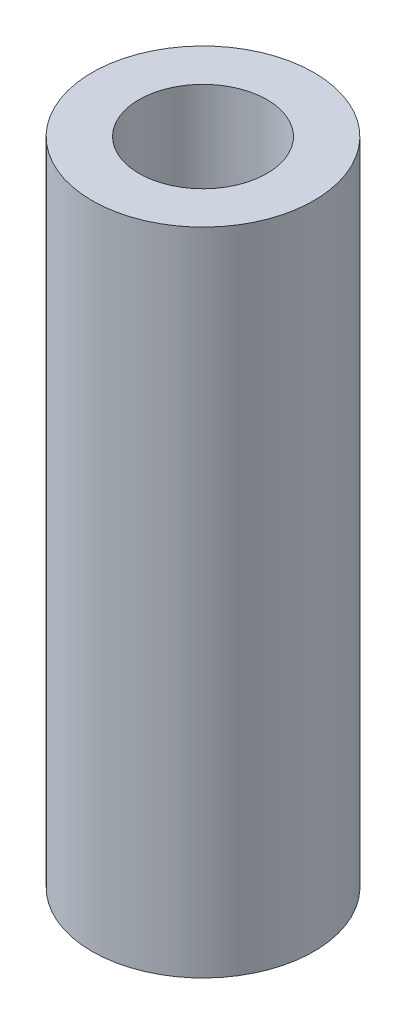
ISO-10303-21;
HEADER;
FILE_DESCRIPTION(('STEP AP214'),'2;1');
FILE_NAME('part.step','',(''),(''),'','','');
FILE_SCHEMA(('AUTOMOTIVE_DESIGN { 1 0 10303 214 1 1 1 1 }'));
ENDSEC;
DATA;
#1=APPLICATION_CONTEXT('core data for automotive mechanical design processes');
#2=APPLICATION_PROTOCOL_DEFINITION('international standard','automotive_design',2000,#1);
#3=PRODUCT_CONTEXT('',#1,'mechanical');
#4=PRODUCT('Part','Part','',(#3));
#5=PRODUCT_RELATED_PRODUCT_CATEGORY('part','',(#4));
#6=PRODUCT_DEFINITION_FORMATION('','',#4);
#7=PRODUCT_DEFINITION_CONTEXT('part definition',#1,'design');
#8=PRODUCT_DEFINITION('design','',#6,#7);
#9=PRODUCT_DEFINITION_SHAPE('','',#8);
#10=(LENGTH_UNIT() NAMED_UNIT(*) SI_UNIT(.MILLI.,.METRE.));
#11=(NAMED_UNIT(*) PLANE_ANGLE_UNIT() SI_UNIT($,.RADIAN.));
#12=(NAMED_UNIT(*) SI_UNIT($,.STERADIAN.) SOLID_ANGLE_UNIT());
#13=UNCERTAINTY_MEASURE_WITH_UNIT(LENGTH_MEASURE(1.E-05),#10,'distance_accuracy_value','');
#14=(GEOMETRIC_REPRESENTATION_CONTEXT(3) GLOBAL_UNCERTAINTY_ASSIGNED_CONTEXT((#13)) GLOBAL_UNIT_ASSIGNED_CONTEXT((#10,
#11,#12)) REPRESENTATION_CONTEXT('',''));
#15=CARTESIAN_POINT('',(0.,0.,0.));
#16=DIRECTION('',(0.,0.,1.));
#17=DIRECTION('',(1.,0.,0.));
#18=AXIS2_PLACEMENT_3D('',#15,#16,#17);
#19=CARTESIAN_POINT('',(0.,19.05,0.));
#20=DIRECTION('',(0.,1.,0.));
#21=DIRECTION('',(0.,0.,1.));
#22=AXIS2_PLACEMENT_3D('',#19,#20,#21);
#23=PLANE('',#22);
#24=CARTESIAN_POINT('',(0.,19.05,0.));
#25=DIRECTION('',(0.,1.,0.));
#26=DIRECTION('',(0.,0.,1.));
#27=AXIS2_PLACEMENT_3D('',#24,#25,#26);
#28=CIRCLE('',#27,3.25);
#29=CARTESIAN_POINT('',(0.,19.05,-3.25));
#30=VERTEX_POINT('',#29);
#31=EDGE_CURVE('E10',#30,#30,#28,.T.);
#32=ORIENTED_EDGE('',*,*,#31,.T.);
#33=EDGE_LOOP('',(#32));
#34=FACE_BOUND('',#33,.T.);
#35=CARTESIAN_POINT('',(0.,19.05,0.));
#36=DIRECTION('',(0.,1.,0.));
#37=DIRECTION('',(0.,0.,1.));
#38=AXIS2_PLACEMENT_3D('',#35,#36,#37);
#39=CIRCLE('',#38,1.875);
#40=CARTESIAN_POINT('',(0.,19.05,-1.875));
#41=VERTEX_POINT('',#40);
#42=EDGE_CURVE('E46',#41,#41,#39,.T.);
#43=ORIENTED_EDGE('',*,*,#42,.F.);
#44=EDGE_LOOP('',(#43));
#45=FACE_BOUND('',#44,.T.);
#46=ADVANCED_FACE('F35',(#34,#45),#23,.T.);
#47=CARTESIAN_POINT('',(0.,0.,0.));
#48=DIRECTION('',(0.,1.,0.));
#49=DIRECTION('',(0.,0.,1.));
#50=AXIS2_PLACEMENT_3D('',#47,#48,#49);
#51=PLANE('',#50);
#52=CARTESIAN_POINT('',(0.,0.,0.));
#53=DIRECTION('',(0.,1.,0.));
#54=DIRECTION('',(0.,0.,1.));
#55=AXIS2_PLACEMENT_3D('',#52,#53,#54);
#56=CIRCLE('',#55,3.25);
#57=CARTESIAN_POINT('',(0.,0.,-3.25));
#58=VERTEX_POINT('',#57);
#59=EDGE_CURVE('E39',#58,#58,#56,.T.);
#60=ORIENTED_EDGE('',*,*,#59,.F.);
#61=EDGE_LOOP('',(#60));
#62=FACE_BOUND('',#61,.T.);
#63=CARTESIAN_POINT('',(0.,0.,0.));
#64=DIRECTION('',(0.,1.,0.));
#65=DIRECTION('',(0.,0.,1.));
#66=AXIS2_PLACEMENT_3D('',#63,#64,#65);
#67=CIRCLE('',#66,1.875);
#68=CARTESIAN_POINT('',(0.,0.,-1.875));
#69=VERTEX_POINT('',#68);
#70=EDGE_CURVE('E48',#69,#69,#67,.T.);
#71=ORIENTED_EDGE('',*,*,#70,.T.);
#72=EDGE_LOOP('',(#71));
#73=FACE_BOUND('',#72,.T.);
#74=ADVANCED_FACE('F58',(#62,#73),#51,.F.);
#75=CARTESIAN_POINT('',(0.,19.05,0.));
#76=DIRECTION('',(0.,-1.,0.));
#77=DIRECTION('',(0.,0.,-1.));
#78=AXIS2_PLACEMENT_3D('',#75,#76,#77);
#79=CYLINDRICAL_SURFACE('',#78,3.25);
#80=CARTESIAN_POINT('',(0.,19.05,-3.25));
#81=CARTESIAN_POINT('',(0.,18.8515625,-3.25));
#82=CARTESIAN_POINT('',(0.,18.653125,-3.25));
#83=CARTESIAN_POINT('',(0.,18.25625,-3.25));
#84=CARTESIAN_POINT('',(0.,18.0578125,-3.25));
#85=CARTESIAN_POINT('',(0.,17.6609375,-3.25));
#86=CARTESIAN_POINT('',(0.,17.4625,-3.25));
#87=CARTESIAN_POINT('',(0.,17.065625,-3.25));
#88=CARTESIAN_POINT('',(0.,16.8671875,-3.25));
#89=CARTESIAN_POINT('',(0.,16.4703125,-3.25));
#90=CARTESIAN_POINT('',(0.,16.271875,-3.25));
#91=CARTESIAN_POINT('',(0.,15.875,-3.25));
#92=CARTESIAN_POINT('',(0.,15.6765625,-3.25));
#93=CARTESIAN_POINT('',(0.,15.2796875,-3.25));
#94=CARTESIAN_POINT('',(0.,15.08125,-3.25));
#95=CARTESIAN_POINT('',(0.,14.684375,-3.25));
#96=CARTESIAN_POINT('',(0.,14.4859375,-3.25));
#97=CARTESIAN_POINT('',(0.,14.0890625,-3.25));
#98=CARTESIAN_POINT('',(0.,13.890625,-3.25));
#99=CARTESIAN_POINT('',(0.,13.49375,-3.25));
#100=CARTESIAN_POINT('',(0.,13.2953125,-3.25));
#101=CARTESIAN_POINT('',(0.,12.8984375,-3.25));
#102=CARTESIAN_POINT('',(0.,12.7,-3.25));
#103=CARTESIAN_POINT('',(0.,12.303125,-3.25));
#104=CARTESIAN_POINT('',(0.,12.1046875,-3.25));
#105=CARTESIAN_POINT('',(0.,11.7078125,-3.25));
#106=CARTESIAN_POINT('',(0.,11.509375,-3.25));
#107=CARTESIAN_POINT('',(0.,11.1125,-3.25));
#108=CARTESIAN_POINT('',(0.,10.9140625,-3.25));
#109=CARTESIAN_POINT('',(0.,10.5171875,-3.25));
#110=CARTESIAN_POINT('',(0.,10.31875,-3.25));
#111=CARTESIAN_POINT('',(0.,9.921875,-3.25));
#112=CARTESIAN_POINT('',(0.,9.7234375,-3.25));
#113=CARTESIAN_POINT('',(0.,9.3265625,-3.25));
#114=CARTESIAN_POINT('',(0.,9.128125,-3.25));
#115=CARTESIAN_POINT('',(0.,8.73125,-3.25));
#116=CARTESIAN_POINT('',(0.,8.5328125,-3.25));
#117=CARTESIAN_POINT('',(0.,8.1359375,-3.25));
#118=CARTESIAN_POINT('',(0.,7.9375,-3.25));
#119=CARTESIAN_POINT('',(0.,7.540625,-3.25));
#120=CARTESIAN_POINT('',(0.,7.3421875,-3.25));
#121=CARTESIAN_POINT('',(0.,6.9453125,-3.25));
#122=CARTESIAN_POINT('',(0.,6.746875,-3.25));
#123=CARTESIAN_POINT('',(0.,6.35,-3.25));
#124=CARTESIAN_POINT('',(0.,6.1515625,-3.25));
#125=CARTESIAN_POINT('',(0.,5.7546875,-3.25));
#126=CARTESIAN_POINT('',(0.,5.55625,-3.25));
#127=CARTESIAN_POINT('',(0.,5.159375,-3.25));
#128=CARTESIAN_POINT('',(0.,4.9609375,-3.25));
#129=CARTESIAN_POINT('',(0.,4.5640625,-3.25));
#130=CARTESIAN_POINT('',(0.,4.365625,-3.25));
#131=CARTESIAN_POINT('',(0.,3.96875,-3.25));
#132=CARTESIAN_POINT('',(0.,3.7703125,-3.25));
#133=CARTESIAN_POINT('',(0.,3.3734375,-3.25));
#134=CARTESIAN_POINT('',(0.,3.175,-3.25));
#135=CARTESIAN_POINT('',(0.,2.778125,-3.25));
#136=CARTESIAN_POINT('',(0.,2.5796875,-3.25));
#137=CARTESIAN_POINT('',(0.,2.1828125,-3.25));
#138=CARTESIAN_POINT('',(0.,1.984375,-3.25));
#139=CARTESIAN_POINT('',(0.,1.5875,-3.25));
#140=CARTESIAN_POINT('',(0.,1.3890625,-3.25));
#141=CARTESIAN_POINT('',(0.,0.992187500000001,-3.25));
#142=CARTESIAN_POINT('',(0.,0.793750000000001,-3.25));
#143=CARTESIAN_POINT('',(0.,0.396875,-3.25));
#144=CARTESIAN_POINT('',(0.,0.1984375,-3.25));
#145=CARTESIAN_POINT('',(0.,0.,-3.25));
#146=B_SPLINE_CURVE_WITH_KNOTS('',3,(#80,#81,#82,#83,#84,#85,#86,#87,#88,#89,#90,#91,#92,#93,
#94,#95,#96,#97,#98,#99,#100,#101,#102,#103,#104,#105,#106,#107,#108,#109,#110,#111,#112,#113,
#114,#115,#116,#117,#118,#119,#120,#121,#122,#123,#124,#125,#126,#127,#128,#129,#130,#131,#132,
#133,#134,#135,#136,#137,#138,#139,#140,#141,#142,#143,#144,#145),.UNSPECIFIED.,.F.,.F.,(4,2,2,
2,2,2,2,2,2,2,2,2,2,2,2,2,2,2,2,2,2,2,2,2,2,2,2,2,2,2,2,2,4),(0.,0.595312499999997,1.190625,
1.7859375,2.38125,2.9765625,3.571875,4.1671875,4.7625,5.3578125,5.953125,6.5484375,7.14375,
7.7390625,8.334375,8.9296875,9.525,10.1203125,10.715625,11.3109375,11.90625,12.5015625,
13.096875,13.6921875,14.2875,14.8828125,15.478125,16.0734375,16.66875,17.2640625,17.859375,
18.4546875,19.05),.UNSPECIFIED.);
#147=EDGE_CURVE('BSEAM37',#30,#58,#146,.T.);
#148=ORIENTED_EDGE('',*,*,#31,.F.);
#149=ORIENTED_EDGE('',*,*,#59,.T.);
#150=ORIENTED_EDGE('',*,*,#147,.T.);
#151=ORIENTED_EDGE('',*,*,#147,.F.);
#152=EDGE_LOOP('',(#148,#150,#149,#151));
#153=FACE_BOUND('',#152,.T.);
#154=ADVANCED_FACE('F37',(#153),#79,.T.);
#155=CARTESIAN_POINT('',(0.,19.05,0.));
#156=DIRECTION('',(0.,-1.,0.));
#157=DIRECTION('',(0.,0.,-1.));
#158=AXIS2_PLACEMENT_3D('',#155,#156,#157);
#159=CYLINDRICAL_SURFACE('',#158,1.875);
#160=CARTESIAN_POINT('',(0.,19.05,-1.875));
#161=CARTESIAN_POINT('',(0.,18.8515625,-1.875));
#162=CARTESIAN_POINT('',(0.,18.653125,-1.875));
#163=CARTESIAN_POINT('',(0.,18.25625,-1.875));
#164=CARTESIAN_POINT('',(0.,18.0578125,-1.875));
#165=CARTESIAN_POINT('',(0.,17.6609375,-1.875));
#166=CARTESIAN_POINT('',(0.,17.4625,-1.875));
#167=CARTESIAN_POINT('',(0.,17.065625,-1.875));
#168=CARTESIAN_POINT('',(0.,16.8671875,-1.875));
#169=CARTESIAN_POINT('',(0.,16.4703125,-1.875));
#170=CARTESIAN_POINT('',(0.,16.271875,-1.875));
#171=CARTESIAN_POINT('',(0.,15.875,-1.875));
#172=CARTESIAN_POINT('',(0.,15.6765625,-1.875));
#173=CARTESIAN_POINT('',(0.,15.2796875,-1.875));
#174=CARTESIAN_POINT('',(0.,15.08125,-1.875));
#175=CARTESIAN_POINT('',(0.,14.684375,-1.875));
#176=CARTESIAN_POINT('',(0.,14.4859375,-1.875));
#177=CARTESIAN_POINT('',(0.,14.0890625,-1.875));
#178=CARTESIAN_POINT('',(0.,13.890625,-1.875));
#179=CARTESIAN_POINT('',(0.,13.49375,-1.875));
#180=CARTESIAN_POINT('',(0.,13.2953125,-1.875));
#181=CARTESIAN_POINT('',(0.,12.8984375,-1.875));
#182=CARTESIAN_POINT('',(0.,12.7,-1.875));
#183=CARTESIAN_POINT('',(0.,12.303125,-1.875));
#184=CARTESIAN_POINT('',(0.,12.1046875,-1.875));
#185=CARTESIAN_POINT('',(0.,11.7078125,-1.875));
#186=CARTESIAN_POINT('',(0.,11.509375,-1.875));
#187=CARTESIAN_POINT('',(0.,11.1125,-1.875));
#188=CARTESIAN_POINT('',(0.,10.9140625,-1.875));
#189=CARTESIAN_POINT('',(0.,10.5171875,-1.875));
#190=CARTESIAN_POINT('',(0.,10.31875,-1.875));
#191=CARTESIAN_POINT('',(0.,9.921875,-1.875));
#192=CARTESIAN_POINT('',(0.,9.7234375,-1.875));
#193=CARTESIAN_POINT('',(0.,9.3265625,-1.875));
#194=CARTESIAN_POINT('',(0.,9.128125,-1.875));
#195=CARTESIAN_POINT('',(0.,8.73125,-1.875));
#196=CARTESIAN_POINT('',(0.,8.5328125,-1.875));
#197=CARTESIAN_POINT('',(0.,8.1359375,-1.875));
#198=CARTESIAN_POINT('',(0.,7.9375,-1.875));
#199=CARTESIAN_POINT('',(0.,7.540625,-1.875));
#200=CARTESIAN_POINT('',(0.,7.3421875,-1.875));
#201=CARTESIAN_POINT('',(0.,6.9453125,-1.875));
#202=CARTESIAN_POINT('',(0.,6.746875,-1.875));
#203=CARTESIAN_POINT('',(0.,6.35,-1.875));
#204=CARTESIAN_POINT('',(0.,6.1515625,-1.875));
#205=CARTESIAN_POINT('',(0.,5.7546875,-1.875));
#206=CARTESIAN_POINT('',(0.,5.55625,-1.875));
#207=CARTESIAN_POINT('',(0.,5.159375,-1.875));
#208=CARTESIAN_POINT('',(0.,4.9609375,-1.875));
#209=CARTESIAN_POINT('',(0.,4.5640625,-1.875));
#210=CARTESIAN_POINT('',(0.,4.365625,-1.875));
#211=CARTESIAN_POINT('',(0.,3.96875,-1.875));
#212=CARTESIAN_POINT('',(0.,3.7703125,-1.875));
#213=CARTESIAN_POINT('',(0.,3.3734375,-1.875));
#214=CARTESIAN_POINT('',(0.,3.175,-1.875));
#215=CARTESIAN_POINT('',(0.,2.778125,-1.875));
#216=CARTESIAN_POINT('',(0.,2.5796875,-1.875));
#217=CARTESIAN_POINT('',(0.,2.1828125,-1.875));
#218=CARTESIAN_POINT('',(0.,1.984375,-1.875));
#219=CARTESIAN_POINT('',(0.,1.5875,-1.875));
#220=CARTESIAN_POINT('',(0.,1.3890625,-1.875));
#221=CARTESIAN_POINT('',(0.,0.992187500000001,-1.875));
#222=CARTESIAN_POINT('',(0.,0.793750000000001,-1.875));
#223=CARTESIAN_POINT('',(0.,0.396875,-1.875));
#224=CARTESIAN_POINT('',(0.,0.1984375,-1.875));
#225=CARTESIAN_POINT('',(0.,0.,-1.875));
#226=B_SPLINE_CURVE_WITH_KNOTS('',3,(#160,#161,#162,#163,#164,#165,#166,#167,#168,#169,#170,
#171,#172,#173,#174,#175,#176,#177,#178,#179,#180,#181,#182,#183,#184,#185,#186,#187,#188,#189,
#190,#191,#192,#193,#194,#195,#196,#197,#198,#199,#200,#201,#202,#203,#204,#205,#206,#207,#208,
#209,#210,#211,#212,#213,#214,#215,#216,#217,#218,#219,#220,#221,#222,#223,#224,#225),
.UNSPECIFIED.,.F.,.F.,(4,2,2,2,2,2,2,2,2,2,2,2,2,2,2,2,2,2,2,2,2,2,2,2,2,2,2,2,2,2,2,2,4),(0.,
0.5953125,1.190625,1.7859375,2.38125,2.9765625,3.571875,4.1671875,4.7625,5.3578125,5.953125,
6.5484375,7.14375,7.7390625,8.334375,8.9296875,9.525,10.1203125,10.715625,11.3109375,11.90625,
12.5015625,13.096875,13.6921875,14.2875,14.8828125,15.478125,16.0734375,16.66875,17.2640625,
17.859375,18.4546875,19.05),.UNSPECIFIED.);
#227=EDGE_CURVE('BSEAM54',#41,#69,#226,.T.);
#228=ORIENTED_EDGE('',*,*,#42,.T.);
#229=ORIENTED_EDGE('',*,*,#70,.F.);
#230=ORIENTED_EDGE('',*,*,#227,.T.);
#231=ORIENTED_EDGE('',*,*,#227,.F.);
#232=EDGE_LOOP('',(#228,#230,#229,#231));
#233=FACE_BOUND('',#232,.T.);
#234=ADVANCED_FACE('F54',(#233),#159,.F.);
#235=CLOSED_SHELL('',(#46,#74,#154,#234));
#236=MANIFOLD_SOLID_BREP('B2',#235);
#237=ADVANCED_BREP_SHAPE_REPRESENTATION('',(#18,#236),#14);
#238=SHAPE_DEFINITION_REPRESENTATION(#9,#237);
ENDSEC;
END-ISO-10303-21;
